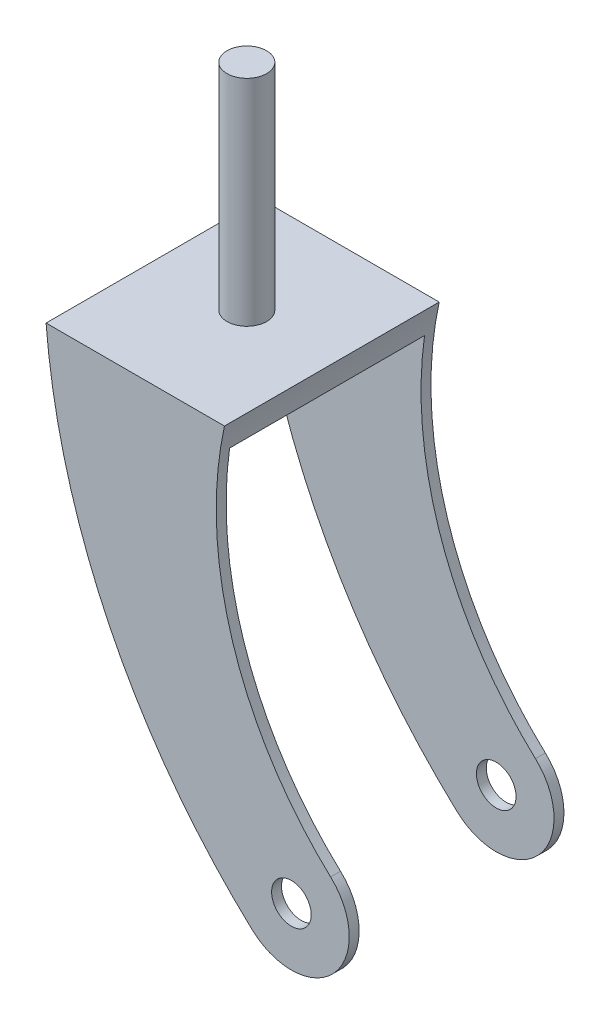
ISO-10303-21;
HEADER;
FILE_DESCRIPTION(('STEP AP214'),'2;1');
FILE_NAME('part.step','',(''),(''),'','','');
FILE_SCHEMA(('AUTOMOTIVE_DESIGN { 1 0 10303 214 1 1 1 1 }'));
ENDSEC;
DATA;
#1=APPLICATION_CONTEXT('core data for automotive mechanical design processes');
#2=APPLICATION_PROTOCOL_DEFINITION('international standard','automotive_design',2000,#1);
#3=PRODUCT_CONTEXT('',#1,'mechanical');
#4=PRODUCT('Part','Part','',(#3));
#5=PRODUCT_RELATED_PRODUCT_CATEGORY('part','',(#4));
#6=PRODUCT_DEFINITION_FORMATION('','',#4);
#7=PRODUCT_DEFINITION_CONTEXT('part definition',#1,'design');
#8=PRODUCT_DEFINITION('design','',#6,#7);
#9=PRODUCT_DEFINITION_SHAPE('','',#8);
#10=(LENGTH_UNIT() NAMED_UNIT(*) SI_UNIT(.MILLI.,.METRE.));
#11=(NAMED_UNIT(*) PLANE_ANGLE_UNIT() SI_UNIT($,.RADIAN.));
#12=(NAMED_UNIT(*) SI_UNIT($,.STERADIAN.) SOLID_ANGLE_UNIT());
#13=UNCERTAINTY_MEASURE_WITH_UNIT(LENGTH_MEASURE(1.E-05),#10,'distance_accuracy_value','');
#14=(GEOMETRIC_REPRESENTATION_CONTEXT(3) GLOBAL_UNCERTAINTY_ASSIGNED_CONTEXT((#13)) GLOBAL_UNIT_ASSIGNED_CONTEXT((#10,
#11,#12)) REPRESENTATION_CONTEXT('',''));
#15=CARTESIAN_POINT('',(0.,0.,0.));
#16=DIRECTION('',(0.,0.,1.));
#17=DIRECTION('',(1.,0.,0.));
#18=AXIS2_PLACEMENT_3D('',#15,#16,#17);
#19=CARTESIAN_POINT('',(-74.2627392292974,110.,65.));
#20=DIRECTION('',(0.,-1.,0.));
#21=DIRECTION('',(1.,0.,0.));
#22=AXIS2_PLACEMENT_3D('',#19,#20,#21);
#23=PLANE('',#22);
#24=DIRECTION('',(-1.,0.,0.));
#25=VECTOR('',#24,1.);
#26=CARTESIAN_POINT('',(-74.2627392292974,110.,0.));
#27=LINE('',#26,#25);
#28=CARTESIAN_POINT('',(-20.2627392292974,110.,0.));
#29=VERTEX_POINT('',#28);
#30=CARTESIAN_POINT('',(-74.2627392292974,110.,0.));
#31=VERTEX_POINT('',#30);
#32=EDGE_CURVE('E84',#29,#31,#27,.T.);
#33=ORIENTED_EDGE('',*,*,#32,.T.);
#34=DIRECTION('',(0.,0.,-1.));
#35=VECTOR('',#34,1.);
#36=CARTESIAN_POINT('',(-74.2627392292974,110.,65.));
#37=LINE('',#36,#35);
#38=CARTESIAN_POINT('',(-74.2627392292974,110.,65.));
#39=VERTEX_POINT('',#38);
#40=EDGE_CURVE('E152',#39,#31,#37,.T.);
#41=ORIENTED_EDGE('',*,*,#40,.F.);
#42=DIRECTION('',(-1.,0.,0.));
#43=VECTOR('',#42,1.);
#44=CARTESIAN_POINT('',(-74.2627392292974,110.,65.));
#45=LINE('',#44,#43);
#46=CARTESIAN_POINT('',(-20.2627392292974,110.,65.));
#47=VERTEX_POINT('',#46);
#48=EDGE_CURVE('E63',#47,#39,#45,.T.);
#49=ORIENTED_EDGE('',*,*,#48,.F.);
#50=DIRECTION('',(0.,0.,-1.));
#51=VECTOR('',#50,1.);
#52=CARTESIAN_POINT('',(-20.2627392292974,110.,65.));
#53=LINE('',#52,#51);
#54=EDGE_CURVE('E162',#47,#29,#53,.T.);
#55=ORIENTED_EDGE('',*,*,#54,.T.);
#56=EDGE_LOOP('',(#33,#41,#49,#55));
#57=FACE_BOUND('',#56,.T.);
#58=CARTESIAN_POINT('',(-47.2627392292974,110.,31.2347786044575));
#59=DIRECTION('',(0.,-1.,0.));
#60=DIRECTION('',(1.,0.,0.));
#61=AXIS2_PLACEMENT_3D('',#58,#59,#60);
#62=CIRCLE('',#61,6.);
#63=CARTESIAN_POINT('',(-41.2627392292974,110.,31.2347786044575));
#64=VERTEX_POINT('',#63);
#65=EDGE_CURVE('E11',#64,#64,#62,.F.);
#66=ORIENTED_EDGE('',*,*,#65,.F.);
#67=EDGE_LOOP('',(#66));
#68=FACE_BOUND('',#67,.T.);
#69=ADVANCED_FACE('F39',(#57,#68),#23,.F.);
#70=CARTESIAN_POINT('',(0.,-5.00000000000001,65.));
#71=DIRECTION('',(0.,0.,-1.));
#72=DIRECTION('',(-1.,0.,0.));
#73=AXIS2_PLACEMENT_3D('',#70,#71,#72);
#74=CYLINDRICAL_SURFACE('',#73,17.4999999999999);
#75=CARTESIAN_POINT('',(0.,-5.00000000000001,62.));
#76=DIRECTION('',(0.,0.,1.));
#77=DIRECTION('',(1.,0.,0.));
#78=AXIS2_PLACEMENT_3D('',#75,#76,#77);
#79=CIRCLE('',#78,17.4999999999999);
#80=CARTESIAN_POINT('',(-11.8727624649408,-17.8564190757415,62.));
#81=VERTEX_POINT('',#80);
#82=CARTESIAN_POINT('',(11.8727624649408,7.85641907574154,62.));
#83=VERTEX_POINT('',#82);
#84=EDGE_CURVE('E120',#81,#83,#79,.T.);
#85=ORIENTED_EDGE('',*,*,#84,.T.);
#86=DIRECTION('',(0.,0.,-1.));
#87=VECTOR('',#86,1.);
#88=CARTESIAN_POINT('',(11.8727624649408,7.85641907574153,65.));
#89=LINE('',#88,#87);
#90=CARTESIAN_POINT('',(11.8727624649408,7.85641907574153,65.));
#91=VERTEX_POINT('',#90);
#92=EDGE_CURVE('E165',#91,#83,#89,.T.);
#93=ORIENTED_EDGE('',*,*,#92,.F.);
#94=CARTESIAN_POINT('',(0.,-5.00000000000001,65.));
#95=DIRECTION('',(0.,0.,1.));
#96=DIRECTION('',(1.,0.,0.));
#97=AXIS2_PLACEMENT_3D('',#94,#95,#96);
#98=CIRCLE('',#97,17.4999999999999);
#99=CARTESIAN_POINT('',(-11.8727624649408,-17.8564190757415,65.));
#100=VERTEX_POINT('',#99);
#101=EDGE_CURVE('E92',#100,#91,#98,.T.);
#102=ORIENTED_EDGE('',*,*,#101,.F.);
#103=DIRECTION('',(0.,0.,-1.));
#104=VECTOR('',#103,1.);
#105=CARTESIAN_POINT('',(-11.8727624649408,-17.8564190757415,65.));
#106=LINE('',#105,#104);
#107=EDGE_CURVE('E169',#100,#81,#106,.T.);
#108=ORIENTED_EDGE('',*,*,#107,.T.);
#109=EDGE_LOOP('',(#85,#93,#102,#108));
#110=FACE_BOUND('',#109,.T.);
#111=ADVANCED_FACE('F200',(#110),#74,.T.);
#112=CARTESIAN_POINT('',(0.,-5.00000000000002,65.));
#113=DIRECTION('',(0.,0.,-1.));
#114=DIRECTION('',(-1.,0.,0.));
#115=AXIS2_PLACEMENT_3D('',#112,#113,#114);
#116=CYLINDRICAL_SURFACE('',#115,6.);
#117=CARTESIAN_POINT('',(0.,-5.00000000000002,3.));
#118=DIRECTION('',(0.,0.,-1.));
#119=DIRECTION('',(-1.,0.,0.));
#120=AXIS2_PLACEMENT_3D('',#117,#118,#119);
#121=CIRCLE('',#120,6.);
#122=CARTESIAN_POINT('',(-6.,-5.00000000000002,3.));
#123=VERTEX_POINT('',#122);
#124=EDGE_CURVE('E124',#123,#123,#121,.T.);
#125=ORIENTED_EDGE('',*,*,#124,.F.);
#126=EDGE_LOOP('',(#125));
#127=FACE_BOUND('',#126,.T.);
#128=CARTESIAN_POINT('',(0.,-5.00000000000002,0.));
#129=DIRECTION('',(0.,0.,1.));
#130=DIRECTION('',(1.,0.,0.));
#131=AXIS2_PLACEMENT_3D('',#128,#129,#130);
#132=CIRCLE('',#131,6.);
#133=CARTESIAN_POINT('',(6.,-5.00000000000002,0.));
#134=VERTEX_POINT('',#133);
#135=EDGE_CURVE('E134',#134,#134,#132,.T.);
#136=ORIENTED_EDGE('',*,*,#135,.F.);
#137=EDGE_LOOP('',(#136));
#138=FACE_BOUND('',#137,.T.);
#139=ADVANCED_FACE('F202',(#127,#138),#116,.F.);
#140=CARTESIAN_POINT('',(121.179775044983,126.21950144988,65.));
#141=DIRECTION('',(0.,0.,1.));
#142=DIRECTION('',(1.,0.,0.));
#143=AXIS2_PLACEMENT_3D('',#140,#141,#142);
#144=PLANE('',#143);
#145=CARTESIAN_POINT('',(121.179775044983,126.21950144988,65.));
#146=DIRECTION('',(0.,0.,1.));
#147=DIRECTION('',(1.,0.,0.));
#148=AXIS2_PLACEMENT_3D('',#145,#146,#147);
#149=CIRCLE('',#148,196.114376355062);
#150=EDGE_CURVE('E146',#39,#100,#149,.T.);
#151=ORIENTED_EDGE('',*,*,#150,.T.);
#152=ORIENTED_EDGE('',*,*,#101,.T.);
#153=CARTESIAN_POINT('',(84.9319264017713,86.9685239181318,65.));
#154=DIRECTION('',(0.,0.,-1.));
#155=DIRECTION('',(1.,0.,0.));
#156=AXIS2_PLACEMENT_3D('',#153,#154,#155);
#157=CIRCLE('',#156,107.686427035825);
#158=EDGE_CURVE('E149',#91,#47,#157,.T.);
#159=ORIENTED_EDGE('',*,*,#158,.T.);
#160=ORIENTED_EDGE('',*,*,#48,.T.);
#161=EDGE_LOOP('',(#151,#152,#159,#160));
#162=FACE_BOUND('',#161,.T.);
#163=CARTESIAN_POINT('',(0.,-5.00000000000002,65.));
#164=DIRECTION('',(0.,0.,1.));
#165=DIRECTION('',(1.,0.,0.));
#166=AXIS2_PLACEMENT_3D('',#163,#164,#165);
#167=CIRCLE('',#166,6.);
#168=CARTESIAN_POINT('',(6.,-5.00000000000002,65.));
#169=VERTEX_POINT('',#168);
#170=EDGE_CURVE('E137',#169,#169,#167,.T.);
#171=ORIENTED_EDGE('',*,*,#170,.F.);
#172=EDGE_LOOP('',(#171));
#173=FACE_BOUND('',#172,.T.);
#174=ADVANCED_FACE('F198',(#162,#173),#144,.T.);
#175=CARTESIAN_POINT('',(121.179775044983,126.21950144988,0.));
#176=DIRECTION('',(0.,0.,1.));
#177=DIRECTION('',(1.,0.,0.));
#178=AXIS2_PLACEMENT_3D('',#175,#176,#177);
#179=PLANE('',#178);
#180=CARTESIAN_POINT('',(121.179775044983,126.21950144988,0.));
#181=DIRECTION('',(0.,0.,1.));
#182=DIRECTION('',(1.,0.,0.));
#183=AXIS2_PLACEMENT_3D('',#180,#181,#182);
#184=CIRCLE('',#183,196.114376355062);
#185=CARTESIAN_POINT('',(-11.8727624649408,-17.8564190757415,0.));
#186=VERTEX_POINT('',#185);
#187=EDGE_CURVE('E144',#31,#186,#184,.T.);
#188=ORIENTED_EDGE('',*,*,#187,.F.);
#189=ORIENTED_EDGE('',*,*,#32,.F.);
#190=CARTESIAN_POINT('',(84.9319264017713,86.9685239181318,0.));
#191=DIRECTION('',(0.,0.,-1.));
#192=DIRECTION('',(1.,0.,0.));
#193=AXIS2_PLACEMENT_3D('',#190,#191,#192);
#194=CIRCLE('',#193,107.686427035825);
#195=CARTESIAN_POINT('',(11.8727624649408,7.85641907574153,0.));
#196=VERTEX_POINT('',#195);
#197=EDGE_CURVE('E158',#196,#29,#194,.T.);
#198=ORIENTED_EDGE('',*,*,#197,.F.);
#199=CARTESIAN_POINT('',(0.,-5.00000000000001,0.));
#200=DIRECTION('',(0.,0.,1.));
#201=DIRECTION('',(1.,0.,0.));
#202=AXIS2_PLACEMENT_3D('',#199,#200,#201);
#203=CIRCLE('',#202,17.4999999999999);
#204=EDGE_CURVE('E155',#186,#196,#203,.T.);
#205=ORIENTED_EDGE('',*,*,#204,.F.);
#206=EDGE_LOOP('',(#188,#189,#198,#205));
#207=FACE_BOUND('',#206,.T.);
#208=ORIENTED_EDGE('',*,*,#135,.T.);
#209=EDGE_LOOP('',(#208));
#210=FACE_BOUND('',#209,.T.);
#211=ADVANCED_FACE('F193',(#207,#210),#179,.F.);
#212=CARTESIAN_POINT('',(121.179775044983,126.21950144988,65.));
#213=DIRECTION('',(0.,0.,-1.));
#214=DIRECTION('',(-1.,0.,0.));
#215=AXIS2_PLACEMENT_3D('',#212,#213,#214);
#216=CYLINDRICAL_SURFACE('',#215,196.114376355062);
#217=CARTESIAN_POINT('',(-11.8727624649408,-17.8564190757415,3.));
#218=VERTEX_POINT('',#217);
#219=EDGE_CURVE('E168',#218,#186,#106,.T.);
#220=ORIENTED_EDGE('',*,*,#219,.F.);
#221=CARTESIAN_POINT('',(121.179775044983,126.21950144988,3.));
#222=DIRECTION('',(0.,0.,-1.));
#223=DIRECTION('',(-1.,0.,0.));
#224=AXIS2_PLACEMENT_3D('',#221,#222,#223);
#225=CIRCLE('',#224,196.114376355062);
#226=CARTESIAN_POINT('',(-73.4333395250639,102.,3.));
#227=VERTEX_POINT('',#226);
#228=EDGE_CURVE('E133',#218,#227,#225,.T.);
#229=ORIENTED_EDGE('',*,*,#228,.T.);
#230=DIRECTION('',(0.,0.,-1.));
#231=VECTOR('',#230,1.);
#232=CARTESIAN_POINT('',(-73.4333395250639,102.,65.));
#233=LINE('',#232,#231);
#234=CARTESIAN_POINT('',(-73.4333395250639,102.,62.));
#235=VERTEX_POINT('',#234);
#236=EDGE_CURVE('E127',#227,#235,#233,.F.);
#237=ORIENTED_EDGE('',*,*,#236,.T.);
#238=CARTESIAN_POINT('',(121.179775044983,126.21950144988,62.));
#239=DIRECTION('',(0.,0.,1.));
#240=DIRECTION('',(1.,0.,0.));
#241=AXIS2_PLACEMENT_3D('',#238,#239,#240);
#242=CIRCLE('',#241,196.114376355062);
#243=EDGE_CURVE('E114',#235,#81,#242,.T.);
#244=ORIENTED_EDGE('',*,*,#243,.T.);
#245=ORIENTED_EDGE('',*,*,#107,.F.);
#246=ORIENTED_EDGE('',*,*,#150,.F.);
#247=ORIENTED_EDGE('',*,*,#40,.T.);
#248=ORIENTED_EDGE('',*,*,#187,.T.);
#249=EDGE_LOOP('',(#220,#229,#237,#244,#245,#246,#247,#248));
#250=FACE_BOUND('',#249,.T.);
#251=ADVANCED_FACE('F41',(#250),#216,.T.);
#252=CARTESIAN_POINT('',(11.8727624649408,7.85641907574154,3.));
#253=VERTEX_POINT('',#252);
#254=EDGE_CURVE('E164',#253,#196,#89,.T.);
#255=ORIENTED_EDGE('',*,*,#254,.F.);
#256=CARTESIAN_POINT('',(0.,-5.00000000000001,3.));
#257=DIRECTION('',(0.,0.,-1.));
#258=DIRECTION('',(-1.,0.,0.));
#259=AXIS2_PLACEMENT_3D('',#256,#257,#258);
#260=CIRCLE('',#259,17.4999999999999);
#261=EDGE_CURVE('E139',#253,#218,#260,.T.);
#262=ORIENTED_EDGE('',*,*,#261,.T.);
#263=ORIENTED_EDGE('',*,*,#219,.T.);
#264=ORIENTED_EDGE('',*,*,#204,.T.);
#265=EDGE_LOOP('',(#255,#262,#263,#264));
#266=FACE_BOUND('',#265,.T.);
#267=ADVANCED_FACE('F187',(#266),#74,.T.);
#268=CARTESIAN_POINT('',(84.9319264017713,86.9685239181318,65.));
#269=DIRECTION('',(0.,0.,-1.));
#270=DIRECTION('',(-1.,0.,0.));
#271=AXIS2_PLACEMENT_3D('',#268,#269,#270);
#272=CYLINDRICAL_SURFACE('',#271,107.686427035825);
#273=DIRECTION('',(0.,0.,-1.));
#274=VECTOR('',#273,1.);
#275=CARTESIAN_POINT('',(-21.7002511739598,102.,65.));
#276=LINE('',#275,#274);
#277=CARTESIAN_POINT('',(-21.7002511739598,102.,62.));
#278=VERTEX_POINT('',#277);
#279=CARTESIAN_POINT('',(-21.7002511739598,102.,3.));
#280=VERTEX_POINT('',#279);
#281=EDGE_CURVE('E47',#278,#280,#276,.T.);
#282=ORIENTED_EDGE('',*,*,#281,.T.);
#283=CARTESIAN_POINT('',(84.9319264017713,86.9685239181318,3.));
#284=DIRECTION('',(0.,0.,-1.));
#285=DIRECTION('',(-1.,0.,0.));
#286=AXIS2_PLACEMENT_3D('',#283,#284,#285);
#287=CIRCLE('',#286,107.686427035825);
#288=EDGE_CURVE('E175',#280,#253,#287,.F.);
#289=ORIENTED_EDGE('',*,*,#288,.T.);
#290=ORIENTED_EDGE('',*,*,#254,.T.);
#291=ORIENTED_EDGE('',*,*,#197,.T.);
#292=ORIENTED_EDGE('',*,*,#54,.F.);
#293=ORIENTED_EDGE('',*,*,#158,.F.);
#294=ORIENTED_EDGE('',*,*,#92,.T.);
#295=CARTESIAN_POINT('',(84.9319264017713,86.9685239181318,62.));
#296=DIRECTION('',(0.,0.,1.));
#297=DIRECTION('',(1.,0.,0.));
#298=AXIS2_PLACEMENT_3D('',#295,#296,#297);
#299=CIRCLE('',#298,107.686427035825);
#300=EDGE_CURVE('E173',#83,#278,#299,.F.);
#301=ORIENTED_EDGE('',*,*,#300,.T.);
#302=EDGE_LOOP('',(#282,#289,#290,#291,#292,#293,#294,#301));
#303=FACE_BOUND('',#302,.T.);
#304=ADVANCED_FACE('F178',(#303),#272,.F.);
#305=CARTESIAN_POINT('',(0.,-5.00000000000002,62.));
#306=DIRECTION('',(0.,0.,1.));
#307=DIRECTION('',(1.,0.,0.));
#308=AXIS2_PLACEMENT_3D('',#305,#306,#307);
#309=CIRCLE('',#308,6.);
#310=CARTESIAN_POINT('',(6.,-5.00000000000002,62.));
#311=VERTEX_POINT('',#310);
#312=EDGE_CURVE('E129',#311,#311,#309,.T.);
#313=ORIENTED_EDGE('',*,*,#312,.F.);
#314=EDGE_LOOP('',(#313));
#315=FACE_BOUND('',#314,.T.);
#316=ORIENTED_EDGE('',*,*,#170,.T.);
#317=EDGE_LOOP('',(#316));
#318=FACE_BOUND('',#317,.T.);
#319=ADVANCED_FACE('F209',(#315,#318),#116,.F.);
#320=CARTESIAN_POINT('',(-74.2627392292974,102.,62.));
#321=DIRECTION('',(0.,1.,0.));
#322=DIRECTION('',(0.,0.,1.));
#323=AXIS2_PLACEMENT_3D('',#320,#321,#322);
#324=PLANE('',#323);
#325=DIRECTION('',(1.,0.,0.));
#326=VECTOR('',#325,1.);
#327=CARTESIAN_POINT('',(-74.2627392292974,102.,3.));
#328=LINE('',#327,#326);
#329=EDGE_CURVE('E54',#227,#280,#328,.T.);
#330=ORIENTED_EDGE('',*,*,#329,.T.);
#331=ORIENTED_EDGE('',*,*,#281,.F.);
#332=DIRECTION('',(1.,0.,0.));
#333=VECTOR('',#332,1.);
#334=CARTESIAN_POINT('',(-74.2627392292974,102.,62.));
#335=LINE('',#334,#333);
#336=EDGE_CURVE('E118',#235,#278,#335,.T.);
#337=ORIENTED_EDGE('',*,*,#336,.F.);
#338=ORIENTED_EDGE('',*,*,#236,.F.);
#339=EDGE_LOOP('',(#330,#331,#337,#338));
#340=FACE_BOUND('',#339,.T.);
#341=ADVANCED_FACE('F126',(#340),#324,.F.);
#342=CARTESIAN_POINT('',(-74.2627392292974,-147.,3.));
#343=DIRECTION('',(0.,0.,-1.));
#344=DIRECTION('',(-1.,0.,0.));
#345=AXIS2_PLACEMENT_3D('',#342,#343,#344);
#346=PLANE('',#345);
#347=ORIENTED_EDGE('',*,*,#124,.T.);
#348=EDGE_LOOP('',(#347));
#349=FACE_BOUND('',#348,.T.);
#350=ORIENTED_EDGE('',*,*,#261,.F.);
#351=ORIENTED_EDGE('',*,*,#288,.F.);
#352=ORIENTED_EDGE('',*,*,#329,.F.);
#353=ORIENTED_EDGE('',*,*,#228,.F.);
#354=EDGE_LOOP('',(#350,#351,#352,#353));
#355=FACE_BOUND('',#354,.T.);
#356=ADVANCED_FACE('F228',(#349,#355),#346,.F.);
#357=CARTESIAN_POINT('',(-74.2627392292974,-147.,62.));
#358=DIRECTION('',(0.,0.,1.));
#359=DIRECTION('',(1.,0.,0.));
#360=AXIS2_PLACEMENT_3D('',#357,#358,#359);
#361=PLANE('',#360);
#362=ORIENTED_EDGE('',*,*,#312,.T.);
#363=EDGE_LOOP('',(#362));
#364=FACE_BOUND('',#363,.T.);
#365=ORIENTED_EDGE('',*,*,#336,.T.);
#366=ORIENTED_EDGE('',*,*,#300,.F.);
#367=ORIENTED_EDGE('',*,*,#84,.F.);
#368=ORIENTED_EDGE('',*,*,#243,.F.);
#369=EDGE_LOOP('',(#365,#366,#367,#368));
#370=FACE_BOUND('',#369,.T.);
#371=ADVANCED_FACE('F116',(#364,#370),#361,.F.);
#372=CARTESIAN_POINT('',(-47.2627392292974,175.,31.2347786044575));
#373=DIRECTION('',(0.,-1.,0.));
#374=DIRECTION('',(1.,0.,0.));
#375=AXIS2_PLACEMENT_3D('',#372,#373,#374);
#376=CYLINDRICAL_SURFACE('',#375,6.);
#377=CARTESIAN_POINT('',(-47.2627392292974,175.,31.2347786044575));
#378=DIRECTION('',(0.,1.,0.));
#379=DIRECTION('',(-1.,0.,0.));
#380=AXIS2_PLACEMENT_3D('',#377,#378,#379);
#381=CIRCLE('',#380,6.);
#382=CARTESIAN_POINT('',(-53.2627392292974,175.,31.2347786044575));
#383=VERTEX_POINT('',#382);
#384=EDGE_CURVE('E248',#383,#383,#381,.T.);
#385=ORIENTED_EDGE('',*,*,#384,.F.);
#386=EDGE_LOOP('',(#385));
#387=FACE_BOUND('',#386,.T.);
#388=ORIENTED_EDGE('',*,*,#65,.T.);
#389=EDGE_LOOP('',(#388));
#390=FACE_BOUND('',#389,.T.);
#391=ADVANCED_FACE('F236',(#387,#390),#376,.T.);
#392=CARTESIAN_POINT('',(-47.2627392292974,175.,31.2347786044575));
#393=DIRECTION('',(0.,1.,0.));
#394=DIRECTION('',(-1.,0.,0.));
#395=AXIS2_PLACEMENT_3D('',#392,#393,#394);
#396=PLANE('',#395);
#397=ORIENTED_EDGE('',*,*,#384,.T.);
#398=EDGE_LOOP('',(#397));
#399=FACE_BOUND('',#398,.T.);
#400=ADVANCED_FACE('F240',(#399),#396,.T.);
#401=CLOSED_SHELL('',(#69,#111,#139,#174,#211,#251,#267,#304,#319,#341,#356,#371,#391,#400));
#402=MANIFOLD_SOLID_BREP('B2',#401);
#403=ADVANCED_BREP_SHAPE_REPRESENTATION('',(#18,#402),#14);
#404=SHAPE_DEFINITION_REPRESENTATION(#9,#403);
ENDSEC;
END-ISO-10303-21;
